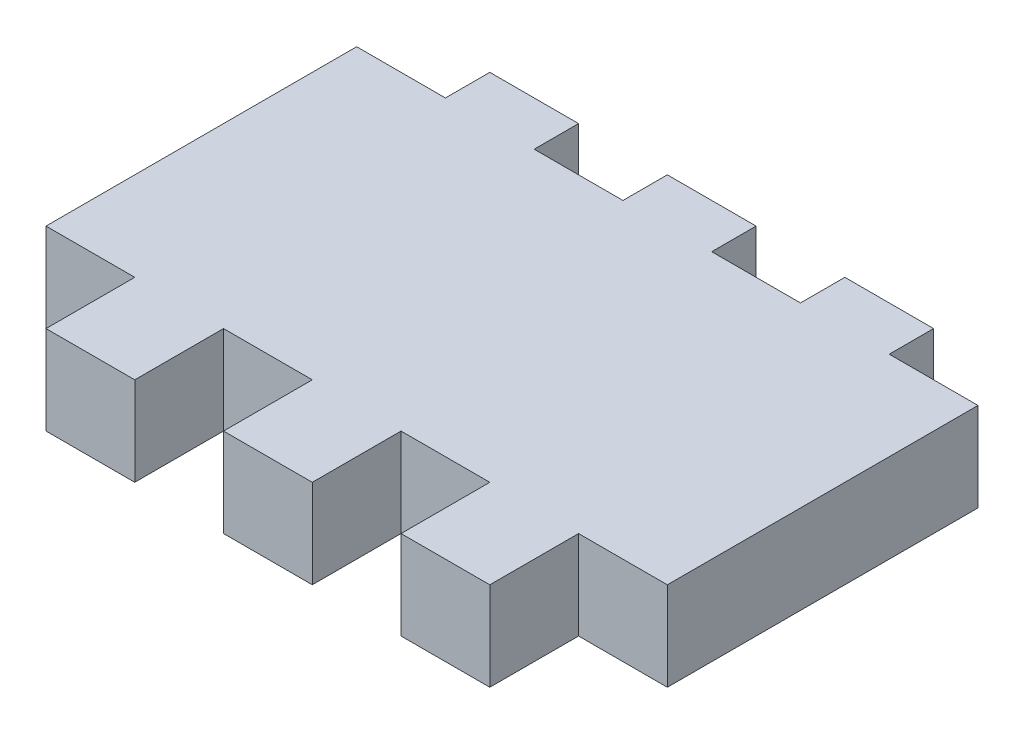
ISO-10303-21;
HEADER;
FILE_DESCRIPTION(('STEP AP214'),'2;1');
FILE_NAME('part.step','',(''),(''),'','','');
FILE_SCHEMA(('AUTOMOTIVE_DESIGN { 1 0 10303 214 1 1 1 1 }'));
ENDSEC;
DATA;
#1=APPLICATION_CONTEXT('core data for automotive mechanical design processes');
#2=APPLICATION_PROTOCOL_DEFINITION('international standard','automotive_design',2000,#1);
#3=PRODUCT_CONTEXT('',#1,'mechanical');
#4=PRODUCT('Part','Part','',(#3));
#5=PRODUCT_RELATED_PRODUCT_CATEGORY('part','',(#4));
#6=PRODUCT_DEFINITION_FORMATION('','',#4);
#7=PRODUCT_DEFINITION_CONTEXT('part definition',#1,'design');
#8=PRODUCT_DEFINITION('design','',#6,#7);
#9=PRODUCT_DEFINITION_SHAPE('','',#8);
#10=(LENGTH_UNIT() NAMED_UNIT(*) SI_UNIT(.MILLI.,.METRE.));
#11=(NAMED_UNIT(*) PLANE_ANGLE_UNIT() SI_UNIT($,.RADIAN.));
#12=(NAMED_UNIT(*) SI_UNIT($,.STERADIAN.) SOLID_ANGLE_UNIT());
#13=UNCERTAINTY_MEASURE_WITH_UNIT(LENGTH_MEASURE(1.E-05),#10,'distance_accuracy_value','');
#14=(GEOMETRIC_REPRESENTATION_CONTEXT(3) GLOBAL_UNCERTAINTY_ASSIGNED_CONTEXT((#13)) GLOBAL_UNIT_ASSIGNED_CONTEXT((#10,
#11,#12)) REPRESENTATION_CONTEXT('',''));
#15=CARTESIAN_POINT('',(0.,0.,0.));
#16=DIRECTION('',(0.,0.,1.));
#17=DIRECTION('',(1.,0.,0.));
#18=AXIS2_PLACEMENT_3D('',#15,#16,#17);
#19=CARTESIAN_POINT('',(-35.,10.,-25.));
#20=DIRECTION('',(0.,0.,1.));
#21=DIRECTION('',(1.,0.,0.));
#22=AXIS2_PLACEMENT_3D('',#19,#20,#21);
#23=PLANE('',#22);
#24=DIRECTION('',(-1.,0.,0.));
#25=VECTOR('',#24,1.);
#26=CARTESIAN_POINT('',(-35.,10.,-25.));
#27=LINE('',#26,#25);
#28=CARTESIAN_POINT('',(4.99999999999999,10.,-25.));
#29=VERTEX_POINT('',#28);
#30=CARTESIAN_POINT('',(-5.00000000000001,10.,-25.));
#31=VERTEX_POINT('',#30);
#32=EDGE_CURVE('E275',#29,#31,#27,.T.);
#33=ORIENTED_EDGE('',*,*,#32,.F.);
#34=DIRECTION('',(0.,1.,0.));
#35=VECTOR('',#34,1.);
#36=CARTESIAN_POINT('',(4.99999999999999,0.,-25.));
#37=LINE('',#36,#35);
#38=CARTESIAN_POINT('',(4.99999999999999,0.,-25.));
#39=VERTEX_POINT('',#38);
#40=EDGE_CURVE('E351',#39,#29,#37,.T.);
#41=ORIENTED_EDGE('',*,*,#40,.F.);
#42=DIRECTION('',(-1.,0.,0.));
#43=VECTOR('',#42,1.);
#44=CARTESIAN_POINT('',(-35.,0.,-25.));
#45=LINE('',#44,#43);
#46=CARTESIAN_POINT('',(-5.00000000000001,0.,-25.));
#47=VERTEX_POINT('',#46);
#48=EDGE_CURVE('E263',#39,#47,#45,.T.);
#49=ORIENTED_EDGE('',*,*,#48,.T.);
#50=DIRECTION('',(0.,1.,0.));
#51=VECTOR('',#50,1.);
#52=CARTESIAN_POINT('',(-5.00000000000001,0.,-25.));
#53=LINE('',#52,#51);
#54=EDGE_CURVE('E321',#47,#31,#53,.T.);
#55=ORIENTED_EDGE('',*,*,#54,.T.);
#56=EDGE_LOOP('',(#33,#41,#49,#55));
#57=FACE_BOUND('',#56,.T.);
#58=ADVANCED_FACE('F35',(#57),#23,.F.);
#59=CARTESIAN_POINT('',(-35.,10.,25.));
#60=DIRECTION('',(0.,0.,-1.));
#61=DIRECTION('',(-1.,0.,0.));
#62=AXIS2_PLACEMENT_3D('',#59,#60,#61);
#63=PLANE('',#62);
#64=DIRECTION('',(1.,0.,0.));
#65=VECTOR('',#64,1.);
#66=CARTESIAN_POINT('',(-35.,0.,25.));
#67=LINE('',#66,#65);
#68=CARTESIAN_POINT('',(-5.00000000000001,0.,25.));
#69=VERTEX_POINT('',#68);
#70=CARTESIAN_POINT('',(4.99999999999999,0.,25.));
#71=VERTEX_POINT('',#70);
#72=EDGE_CURVE('E239',#69,#71,#67,.T.);
#73=ORIENTED_EDGE('',*,*,#72,.T.);
#74=DIRECTION('',(0.,1.,0.));
#75=VECTOR('',#74,1.);
#76=CARTESIAN_POINT('',(4.99999999999999,0.,25.));
#77=LINE('',#76,#75);
#78=CARTESIAN_POINT('',(4.99999999999999,10.,25.));
#79=VERTEX_POINT('',#78);
#80=EDGE_CURVE('E223',#71,#79,#77,.T.);
#81=ORIENTED_EDGE('',*,*,#80,.T.);
#82=DIRECTION('',(1.,0.,0.));
#83=VECTOR('',#82,1.);
#84=CARTESIAN_POINT('',(-35.,10.,25.));
#85=LINE('',#84,#83);
#86=CARTESIAN_POINT('',(-5.00000000000001,10.,25.));
#87=VERTEX_POINT('',#86);
#88=EDGE_CURVE('E44',#87,#79,#85,.T.);
#89=ORIENTED_EDGE('',*,*,#88,.F.);
#90=DIRECTION('',(0.,1.,0.));
#91=VECTOR('',#90,1.);
#92=CARTESIAN_POINT('',(-5.00000000000001,0.,25.));
#93=LINE('',#92,#91);
#94=EDGE_CURVE('E246',#69,#87,#93,.T.);
#95=ORIENTED_EDGE('',*,*,#94,.F.);
#96=EDGE_LOOP('',(#73,#81,#89,#95));
#97=FACE_BOUND('',#96,.T.);
#98=ADVANCED_FACE('F245',(#97),#63,.F.);
#99=CARTESIAN_POINT('',(-25.,0.,25.));
#100=VERTEX_POINT('',#99);
#101=CARTESIAN_POINT('',(-15.,0.,25.));
#102=VERTEX_POINT('',#101);
#103=EDGE_CURVE('E39',#100,#102,#67,.T.);
#104=ORIENTED_EDGE('',*,*,#103,.T.);
#105=DIRECTION('',(0.,1.,0.));
#106=VECTOR('',#105,1.);
#107=CARTESIAN_POINT('',(-15.,0.,25.));
#108=LINE('',#107,#106);
#109=CARTESIAN_POINT('',(-15.,10.,25.));
#110=VERTEX_POINT('',#109);
#111=EDGE_CURVE('E371',#102,#110,#108,.T.);
#112=ORIENTED_EDGE('',*,*,#111,.T.);
#113=CARTESIAN_POINT('',(-25.,10.,25.));
#114=VERTEX_POINT('',#113);
#115=EDGE_CURVE('E11',#114,#110,#85,.T.);
#116=ORIENTED_EDGE('',*,*,#115,.F.);
#117=DIRECTION('',(0.,1.,0.));
#118=VECTOR('',#117,1.);
#119=CARTESIAN_POINT('',(-25.,0.,25.));
#120=LINE('',#119,#118);
#121=EDGE_CURVE('E299',#100,#114,#120,.T.);
#122=ORIENTED_EDGE('',*,*,#121,.F.);
#123=EDGE_LOOP('',(#104,#112,#116,#122));
#124=FACE_BOUND('',#123,.T.);
#125=ADVANCED_FACE('F461',(#124),#63,.F.);
#126=CARTESIAN_POINT('',(-15.,10.,-25.));
#127=VERTEX_POINT('',#126);
#128=CARTESIAN_POINT('',(-25.,10.,-25.));
#129=VERTEX_POINT('',#128);
#130=EDGE_CURVE('E277',#127,#129,#27,.T.);
#131=ORIENTED_EDGE('',*,*,#130,.F.);
#132=DIRECTION('',(0.,1.,0.));
#133=VECTOR('',#132,1.);
#134=CARTESIAN_POINT('',(-15.,0.,-25.));
#135=LINE('',#134,#133);
#136=CARTESIAN_POINT('',(-15.,0.,-25.));
#137=VERTEX_POINT('',#136);
#138=EDGE_CURVE('E311',#137,#127,#135,.T.);
#139=ORIENTED_EDGE('',*,*,#138,.F.);
#140=CARTESIAN_POINT('',(-25.,0.,-25.));
#141=VERTEX_POINT('',#140);
#142=EDGE_CURVE('E265',#137,#141,#45,.T.);
#143=ORIENTED_EDGE('',*,*,#142,.T.);
#144=DIRECTION('',(0.,1.,0.));
#145=VECTOR('',#144,1.);
#146=CARTESIAN_POINT('',(-25.,0.,-25.));
#147=LINE('',#146,#145);
#148=EDGE_CURVE('E269',#141,#129,#147,.T.);
#149=ORIENTED_EDGE('',*,*,#148,.T.);
#150=EDGE_LOOP('',(#131,#139,#143,#149));
#151=FACE_BOUND('',#150,.T.);
#152=ADVANCED_FACE('F483',(#151),#23,.F.);
#153=CARTESIAN_POINT('',(35.,10.,25.));
#154=DIRECTION('',(-1.,0.,0.));
#155=DIRECTION('',(0.,0.,1.));
#156=AXIS2_PLACEMENT_3D('',#153,#154,#155);
#157=PLANE('',#156);
#158=DIRECTION('',(0.,0.,-1.));
#159=VECTOR('',#158,1.);
#160=CARTESIAN_POINT('',(35.,10.,25.));
#161=LINE('',#160,#159);
#162=CARTESIAN_POINT('',(35.,10.,15.));
#163=VERTEX_POINT('',#162);
#164=CARTESIAN_POINT('',(35.,10.,-20.));
#165=VERTEX_POINT('',#164);
#166=EDGE_CURVE('E249',#163,#165,#161,.T.);
#167=ORIENTED_EDGE('',*,*,#166,.F.);
#168=DIRECTION('',(0.,1.,0.));
#169=VECTOR('',#168,1.);
#170=CARTESIAN_POINT('',(35.,0.,15.));
#171=LINE('',#170,#169);
#172=CARTESIAN_POINT('',(35.,0.,15.));
#173=VERTEX_POINT('',#172);
#174=EDGE_CURVE('E395',#173,#163,#171,.T.);
#175=ORIENTED_EDGE('',*,*,#174,.F.);
#176=DIRECTION('',(0.,0.,-1.));
#177=VECTOR('',#176,1.);
#178=CARTESIAN_POINT('',(35.,0.,25.));
#179=LINE('',#178,#177);
#180=CARTESIAN_POINT('',(35.,0.,-20.));
#181=VERTEX_POINT('',#180);
#182=EDGE_CURVE('E267',#173,#181,#179,.T.);
#183=ORIENTED_EDGE('',*,*,#182,.T.);
#184=DIRECTION('',(0.,1.,0.));
#185=VECTOR('',#184,1.);
#186=CARTESIAN_POINT('',(35.,0.,-20.));
#187=LINE('',#186,#185);
#188=EDGE_CURVE('E411',#181,#165,#187,.T.);
#189=ORIENTED_EDGE('',*,*,#188,.T.);
#190=EDGE_LOOP('',(#167,#175,#183,#189));
#191=FACE_BOUND('',#190,.T.);
#192=ADVANCED_FACE('F37',(#191),#157,.F.);
#193=CARTESIAN_POINT('',(25.,10.,-25.));
#194=VERTEX_POINT('',#193);
#195=CARTESIAN_POINT('',(15.,10.,-25.));
#196=VERTEX_POINT('',#195);
#197=EDGE_CURVE('E274',#194,#196,#27,.T.);
#198=ORIENTED_EDGE('',*,*,#197,.F.);
#199=DIRECTION('',(0.,1.,0.));
#200=VECTOR('',#199,1.);
#201=CARTESIAN_POINT('',(25.,0.,-25.));
#202=LINE('',#201,#200);
#203=CARTESIAN_POINT('',(25.,0.,-25.));
#204=VERTEX_POINT('',#203);
#205=EDGE_CURVE('E415',#204,#194,#202,.T.);
#206=ORIENTED_EDGE('',*,*,#205,.F.);
#207=CARTESIAN_POINT('',(15.,0.,-25.));
#208=VERTEX_POINT('',#207);
#209=EDGE_CURVE('E257',#204,#208,#45,.T.);
#210=ORIENTED_EDGE('',*,*,#209,.T.);
#211=DIRECTION('',(0.,1.,0.));
#212=VECTOR('',#211,1.);
#213=CARTESIAN_POINT('',(15.,0.,-25.));
#214=LINE('',#213,#212);
#215=EDGE_CURVE('E348',#208,#196,#214,.T.);
#216=ORIENTED_EDGE('',*,*,#215,.T.);
#217=EDGE_LOOP('',(#198,#206,#210,#216));
#218=FACE_BOUND('',#217,.T.);
#219=ADVANCED_FACE('F516',(#218),#23,.F.);
#220=CARTESIAN_POINT('',(-35.,10.,25.));
#221=DIRECTION('',(1.,0.,0.));
#222=DIRECTION('',(0.,0.,-1.));
#223=AXIS2_PLACEMENT_3D('',#220,#221,#222);
#224=PLANE('',#223);
#225=DIRECTION('',(0.,0.,1.));
#226=VECTOR('',#225,1.);
#227=CARTESIAN_POINT('',(-35.,0.,25.));
#228=LINE('',#227,#226);
#229=CARTESIAN_POINT('',(-35.,0.,-20.));
#230=VERTEX_POINT('',#229);
#231=CARTESIAN_POINT('',(-35.,0.,15.));
#232=VERTEX_POINT('',#231);
#233=EDGE_CURVE('E251',#230,#232,#228,.T.);
#234=ORIENTED_EDGE('',*,*,#233,.T.);
#235=DIRECTION('',(0.,1.,0.));
#236=VECTOR('',#235,1.);
#237=CARTESIAN_POINT('',(-35.,0.,15.));
#238=LINE('',#237,#236);
#239=CARTESIAN_POINT('',(-35.,10.,15.));
#240=VERTEX_POINT('',#239);
#241=EDGE_CURVE('E294',#232,#240,#238,.T.);
#242=ORIENTED_EDGE('',*,*,#241,.T.);
#243=DIRECTION('',(0.,0.,1.));
#244=VECTOR('',#243,1.);
#245=CARTESIAN_POINT('',(-35.,10.,25.));
#246=LINE('',#245,#244);
#247=CARTESIAN_POINT('',(-35.,10.,-20.));
#248=VERTEX_POINT('',#247);
#249=EDGE_CURVE('E271',#248,#240,#246,.T.);
#250=ORIENTED_EDGE('',*,*,#249,.F.);
#251=DIRECTION('',(0.,1.,0.));
#252=VECTOR('',#251,1.);
#253=CARTESIAN_POINT('',(-35.,0.,-20.));
#254=LINE('',#253,#252);
#255=EDGE_CURVE('E280',#230,#248,#254,.T.);
#256=ORIENTED_EDGE('',*,*,#255,.F.);
#257=EDGE_LOOP('',(#234,#242,#250,#256));
#258=FACE_BOUND('',#257,.T.);
#259=ADVANCED_FACE('F471',(#258),#224,.F.);
#260=CARTESIAN_POINT('',(15.,0.,25.));
#261=VERTEX_POINT('',#260);
#262=CARTESIAN_POINT('',(25.,0.,25.));
#263=VERTEX_POINT('',#262);
#264=EDGE_CURVE('E247',#261,#263,#67,.T.);
#265=ORIENTED_EDGE('',*,*,#264,.T.);
#266=DIRECTION('',(0.,1.,0.));
#267=VECTOR('',#266,1.);
#268=CARTESIAN_POINT('',(25.,0.,25.));
#269=LINE('',#268,#267);
#270=CARTESIAN_POINT('',(25.,10.,25.));
#271=VERTEX_POINT('',#270);
#272=EDGE_CURVE('E393',#263,#271,#269,.T.);
#273=ORIENTED_EDGE('',*,*,#272,.T.);
#274=CARTESIAN_POINT('',(15.,10.,25.));
#275=VERTEX_POINT('',#274);
#276=EDGE_CURVE('E46',#275,#271,#85,.T.);
#277=ORIENTED_EDGE('',*,*,#276,.F.);
#278=DIRECTION('',(0.,1.,0.));
#279=VECTOR('',#278,1.);
#280=CARTESIAN_POINT('',(15.,0.,25.));
#281=LINE('',#280,#279);
#282=EDGE_CURVE('E233',#261,#275,#281,.T.);
#283=ORIENTED_EDGE('',*,*,#282,.F.);
#284=EDGE_LOOP('',(#265,#273,#277,#283));
#285=FACE_BOUND('',#284,.T.);
#286=ADVANCED_FACE('F441',(#285),#63,.F.);
#287=CARTESIAN_POINT('',(0.,10.,0.));
#288=DIRECTION('',(0.,-1.,0.));
#289=DIRECTION('',(0.,0.,-1.));
#290=AXIS2_PLACEMENT_3D('',#287,#288,#289);
#291=PLANE('',#290);
#292=ORIENTED_EDGE('',*,*,#276,.T.);
#293=DIRECTION('',(0.,0.,1.));
#294=VECTOR('',#293,1.);
#295=CARTESIAN_POINT('',(25.,10.,25.));
#296=LINE('',#295,#294);
#297=CARTESIAN_POINT('',(25.,10.,15.));
#298=VERTEX_POINT('',#297);
#299=EDGE_CURVE('E404',#298,#271,#296,.T.);
#300=ORIENTED_EDGE('',*,*,#299,.F.);
#301=DIRECTION('',(-1.,0.,0.));
#302=VECTOR('',#301,1.);
#303=CARTESIAN_POINT('',(25.,10.,15.));
#304=LINE('',#303,#302);
#305=EDGE_CURVE('E401',#163,#298,#304,.T.);
#306=ORIENTED_EDGE('',*,*,#305,.F.);
#307=ORIENTED_EDGE('',*,*,#166,.T.);
#308=DIRECTION('',(1.,0.,0.));
#309=VECTOR('',#308,1.);
#310=CARTESIAN_POINT('',(25.,10.,-20.));
#311=LINE('',#310,#309);
#312=CARTESIAN_POINT('',(25.,10.,-20.));
#313=VERTEX_POINT('',#312);
#314=EDGE_CURVE('E417',#313,#165,#311,.T.);
#315=ORIENTED_EDGE('',*,*,#314,.F.);
#316=DIRECTION('',(0.,0.,1.));
#317=VECTOR('',#316,1.);
#318=CARTESIAN_POINT('',(25.,10.,-25.));
#319=LINE('',#318,#317);
#320=EDGE_CURVE('E400',#194,#313,#319,.T.);
#321=ORIENTED_EDGE('',*,*,#320,.F.);
#322=ORIENTED_EDGE('',*,*,#197,.T.);
#323=DIRECTION('',(0.,0.,-1.));
#324=VECTOR('',#323,1.);
#325=CARTESIAN_POINT('',(15.,10.,-25.));
#326=LINE('',#325,#324);
#327=CARTESIAN_POINT('',(15.,10.,-20.));
#328=VERTEX_POINT('',#327);
#329=EDGE_CURVE('E354',#328,#196,#326,.T.);
#330=ORIENTED_EDGE('',*,*,#329,.F.);
#331=DIRECTION('',(1.,0.,0.));
#332=VECTOR('',#331,1.);
#333=CARTESIAN_POINT('',(4.99999999999999,10.,-20.));
#334=LINE('',#333,#332);
#335=CARTESIAN_POINT('',(4.99999999999999,10.,-20.));
#336=VERTEX_POINT('',#335);
#337=EDGE_CURVE('E357',#336,#328,#334,.T.);
#338=ORIENTED_EDGE('',*,*,#337,.F.);
#339=DIRECTION('',(0.,0.,1.));
#340=VECTOR('',#339,1.);
#341=CARTESIAN_POINT('',(4.99999999999999,10.,-25.));
#342=LINE('',#341,#340);
#343=EDGE_CURVE('E360',#29,#336,#342,.T.);
#344=ORIENTED_EDGE('',*,*,#343,.F.);
#345=ORIENTED_EDGE('',*,*,#32,.T.);
#346=DIRECTION('',(0.,0.,-1.));
#347=VECTOR('',#346,1.);
#348=CARTESIAN_POINT('',(-5.00000000000001,10.,-25.));
#349=LINE('',#348,#347);
#350=CARTESIAN_POINT('',(-5.00000000000001,10.,-20.));
#351=VERTEX_POINT('',#350);
#352=EDGE_CURVE('E325',#351,#31,#349,.T.);
#353=ORIENTED_EDGE('',*,*,#352,.F.);
#354=DIRECTION('',(1.,0.,0.));
#355=VECTOR('',#354,1.);
#356=CARTESIAN_POINT('',(-15.,10.,-20.));
#357=LINE('',#356,#355);
#358=CARTESIAN_POINT('',(-15.,10.,-20.));
#359=VERTEX_POINT('',#358);
#360=EDGE_CURVE('E329',#359,#351,#357,.T.);
#361=ORIENTED_EDGE('',*,*,#360,.F.);
#362=DIRECTION('',(0.,0.,1.));
#363=VECTOR('',#362,1.);
#364=CARTESIAN_POINT('',(-15.,10.,-25.));
#365=LINE('',#364,#363);
#366=EDGE_CURVE('E332',#127,#359,#365,.T.);
#367=ORIENTED_EDGE('',*,*,#366,.F.);
#368=ORIENTED_EDGE('',*,*,#130,.T.);
#369=DIRECTION('',(0.,0.,-1.));
#370=VECTOR('',#369,1.);
#371=CARTESIAN_POINT('',(-25.,10.,-25.));
#372=LINE('',#371,#370);
#373=CARTESIAN_POINT('',(-25.,10.,-20.));
#374=VERTEX_POINT('',#373);
#375=EDGE_CURVE('E287',#374,#129,#372,.T.);
#376=ORIENTED_EDGE('',*,*,#375,.F.);
#377=DIRECTION('',(1.,0.,0.));
#378=VECTOR('',#377,1.);
#379=CARTESIAN_POINT('',(-35.,10.,-20.));
#380=LINE('',#379,#378);
#381=EDGE_CURVE('E291',#248,#374,#380,.T.);
#382=ORIENTED_EDGE('',*,*,#381,.F.);
#383=ORIENTED_EDGE('',*,*,#249,.T.);
#384=DIRECTION('',(-1.,0.,0.));
#385=VECTOR('',#384,1.);
#386=CARTESIAN_POINT('',(-35.,10.,15.));
#387=LINE('',#386,#385);
#388=CARTESIAN_POINT('',(-25.,10.,15.));
#389=VERTEX_POINT('',#388);
#390=EDGE_CURVE('E305',#389,#240,#387,.T.);
#391=ORIENTED_EDGE('',*,*,#390,.F.);
#392=DIRECTION('',(0.,0.,-1.));
#393=VECTOR('',#392,1.);
#394=CARTESIAN_POINT('',(-25.,10.,25.));
#395=LINE('',#394,#393);
#396=EDGE_CURVE('E308',#114,#389,#395,.T.);
#397=ORIENTED_EDGE('',*,*,#396,.F.);
#398=ORIENTED_EDGE('',*,*,#115,.T.);
#399=DIRECTION('',(0.,0.,1.));
#400=VECTOR('',#399,1.);
#401=CARTESIAN_POINT('',(-15.,10.,25.));
#402=LINE('',#401,#400);
#403=CARTESIAN_POINT('',(-15.,10.,15.));
#404=VERTEX_POINT('',#403);
#405=EDGE_CURVE('E353',#404,#110,#402,.T.);
#406=ORIENTED_EDGE('',*,*,#405,.F.);
#407=DIRECTION('',(-1.,0.,0.));
#408=VECTOR('',#407,1.);
#409=CARTESIAN_POINT('',(-15.,10.,15.));
#410=LINE('',#409,#408);
#411=CARTESIAN_POINT('',(-5.00000000000001,10.,15.));
#412=VERTEX_POINT('',#411);
#413=EDGE_CURVE('E379',#412,#404,#410,.T.);
#414=ORIENTED_EDGE('',*,*,#413,.F.);
#415=DIRECTION('',(0.,0.,-1.));
#416=VECTOR('',#415,1.);
#417=CARTESIAN_POINT('',(-5.00000000000001,10.,25.));
#418=LINE('',#417,#416);
#419=EDGE_CURVE('E383',#87,#412,#418,.T.);
#420=ORIENTED_EDGE('',*,*,#419,.F.);
#421=ORIENTED_EDGE('',*,*,#88,.T.);
#422=DIRECTION('',(0.,0.,1.));
#423=VECTOR('',#422,1.);
#424=CARTESIAN_POINT('',(4.99999999999999,10.,25.));
#425=LINE('',#424,#423);
#426=CARTESIAN_POINT('',(4.99999999999999,10.,15.));
#427=VERTEX_POINT('',#426);
#428=EDGE_CURVE('E228',#427,#79,#425,.T.);
#429=ORIENTED_EDGE('',*,*,#428,.F.);
#430=DIRECTION('',(-1.,0.,0.));
#431=VECTOR('',#430,1.);
#432=CARTESIAN_POINT('',(4.99999999999999,10.,15.));
#433=LINE('',#432,#431);
#434=CARTESIAN_POINT('',(15.,10.,15.));
#435=VERTEX_POINT('',#434);
#436=EDGE_CURVE('E242',#435,#427,#433,.T.);
#437=ORIENTED_EDGE('',*,*,#436,.F.);
#438=DIRECTION('',(0.,0.,-1.));
#439=VECTOR('',#438,1.);
#440=CARTESIAN_POINT('',(15.,10.,25.));
#441=LINE('',#440,#439);
#442=EDGE_CURVE('E432',#275,#435,#441,.T.);
#443=ORIENTED_EDGE('',*,*,#442,.F.);
#444=EDGE_LOOP('',(#292,#300,#306,#307,#315,#321,#322,#330,#338,#344,#345,#353,#361,#367,#368,
#376,#382,#383,#391,#397,#398,#406,#414,#420,#421,#429,#437,#443));
#445=FACE_BOUND('',#444,.T.);
#446=ADVANCED_FACE('F446',(#445),#291,.F.);
#447=CARTESIAN_POINT('',(0.,0.,0.));
#448=DIRECTION('',(0.,-1.,0.));
#449=DIRECTION('',(0.,0.,-1.));
#450=AXIS2_PLACEMENT_3D('',#447,#448,#449);
#451=PLANE('',#450);
#452=DIRECTION('',(0.,0.,1.));
#453=VECTOR('',#452,1.);
#454=CARTESIAN_POINT('',(25.,0.,25.));
#455=LINE('',#454,#453);
#456=CARTESIAN_POINT('',(25.,0.,15.));
#457=VERTEX_POINT('',#456);
#458=EDGE_CURVE('E53',#457,#263,#455,.T.);
#459=ORIENTED_EDGE('',*,*,#458,.T.);
#460=ORIENTED_EDGE('',*,*,#264,.F.);
#461=DIRECTION('',(0.,0.,-1.));
#462=VECTOR('',#461,1.);
#463=CARTESIAN_POINT('',(15.,0.,25.));
#464=LINE('',#463,#462);
#465=CARTESIAN_POINT('',(15.,0.,15.));
#466=VERTEX_POINT('',#465);
#467=EDGE_CURVE('E241',#261,#466,#464,.T.);
#468=ORIENTED_EDGE('',*,*,#467,.T.);
#469=DIRECTION('',(-1.,0.,0.));
#470=VECTOR('',#469,1.);
#471=CARTESIAN_POINT('',(4.99999999999999,0.,15.));
#472=LINE('',#471,#470);
#473=CARTESIAN_POINT('',(4.99999999999999,0.,15.));
#474=VERTEX_POINT('',#473);
#475=EDGE_CURVE('E61',#466,#474,#472,.T.);
#476=ORIENTED_EDGE('',*,*,#475,.T.);
#477=DIRECTION('',(0.,0.,1.));
#478=VECTOR('',#477,1.);
#479=CARTESIAN_POINT('',(4.99999999999999,0.,25.));
#480=LINE('',#479,#478);
#481=EDGE_CURVE('E226',#474,#71,#480,.T.);
#482=ORIENTED_EDGE('',*,*,#481,.T.);
#483=ORIENTED_EDGE('',*,*,#72,.F.);
#484=DIRECTION('',(0.,0.,-1.));
#485=VECTOR('',#484,1.);
#486=CARTESIAN_POINT('',(-5.00000000000001,0.,25.));
#487=LINE('',#486,#485);
#488=CARTESIAN_POINT('',(-5.00000000000001,0.,15.));
#489=VERTEX_POINT('',#488);
#490=EDGE_CURVE('E389',#69,#489,#487,.T.);
#491=ORIENTED_EDGE('',*,*,#490,.T.);
#492=DIRECTION('',(-1.,0.,0.));
#493=VECTOR('',#492,1.);
#494=CARTESIAN_POINT('',(-15.,0.,15.));
#495=LINE('',#494,#493);
#496=CARTESIAN_POINT('',(-15.,0.,15.));
#497=VERTEX_POINT('',#496);
#498=EDGE_CURVE('E374',#489,#497,#495,.T.);
#499=ORIENTED_EDGE('',*,*,#498,.T.);
#500=DIRECTION('',(0.,0.,1.));
#501=VECTOR('',#500,1.);
#502=CARTESIAN_POINT('',(-15.,0.,25.));
#503=LINE('',#502,#501);
#504=EDGE_CURVE('E382',#497,#102,#503,.T.);
#505=ORIENTED_EDGE('',*,*,#504,.T.);
#506=ORIENTED_EDGE('',*,*,#103,.F.);
#507=DIRECTION('',(0.,0.,-1.));
#508=VECTOR('',#507,1.);
#509=CARTESIAN_POINT('',(-25.,0.,25.));
#510=LINE('',#509,#508);
#511=CARTESIAN_POINT('',(-25.,0.,15.));
#512=VERTEX_POINT('',#511);
#513=EDGE_CURVE('E307',#100,#512,#510,.T.);
#514=ORIENTED_EDGE('',*,*,#513,.T.);
#515=DIRECTION('',(-1.,0.,0.));
#516=VECTOR('',#515,1.);
#517=CARTESIAN_POINT('',(-35.,0.,15.));
#518=LINE('',#517,#516);
#519=EDGE_CURVE('E302',#512,#232,#518,.T.);
#520=ORIENTED_EDGE('',*,*,#519,.T.);
#521=ORIENTED_EDGE('',*,*,#233,.F.);
#522=DIRECTION('',(1.,0.,0.));
#523=VECTOR('',#522,1.);
#524=CARTESIAN_POINT('',(-35.,0.,-20.));
#525=LINE('',#524,#523);
#526=CARTESIAN_POINT('',(-25.,0.,-20.));
#527=VERTEX_POINT('',#526);
#528=EDGE_CURVE('E290',#230,#527,#525,.T.);
#529=ORIENTED_EDGE('',*,*,#528,.T.);
#530=DIRECTION('',(0.,0.,-1.));
#531=VECTOR('',#530,1.);
#532=CARTESIAN_POINT('',(-25.,0.,-25.));
#533=LINE('',#532,#531);
#534=EDGE_CURVE('E283',#527,#141,#533,.T.);
#535=ORIENTED_EDGE('',*,*,#534,.T.);
#536=ORIENTED_EDGE('',*,*,#142,.F.);
#537=DIRECTION('',(0.,0.,1.));
#538=VECTOR('',#537,1.);
#539=CARTESIAN_POINT('',(-15.,0.,-25.));
#540=LINE('',#539,#538);
#541=CARTESIAN_POINT('',(-15.,0.,-20.));
#542=VERTEX_POINT('',#541);
#543=EDGE_CURVE('E328',#137,#542,#540,.T.);
#544=ORIENTED_EDGE('',*,*,#543,.T.);
#545=DIRECTION('',(1.,0.,0.));
#546=VECTOR('',#545,1.);
#547=CARTESIAN_POINT('',(-15.,0.,-20.));
#548=LINE('',#547,#546);
#549=CARTESIAN_POINT('',(-5.00000000000001,0.,-20.));
#550=VERTEX_POINT('',#549);
#551=EDGE_CURVE('E338',#542,#550,#548,.T.);
#552=ORIENTED_EDGE('',*,*,#551,.T.);
#553=DIRECTION('',(0.,0.,-1.));
#554=VECTOR('',#553,1.);
#555=CARTESIAN_POINT('',(-5.00000000000001,0.,-25.));
#556=LINE('',#555,#554);
#557=EDGE_CURVE('E319',#550,#47,#556,.T.);
#558=ORIENTED_EDGE('',*,*,#557,.T.);
#559=ORIENTED_EDGE('',*,*,#48,.F.);
#560=DIRECTION('',(0.,0.,1.));
#561=VECTOR('',#560,1.);
#562=CARTESIAN_POINT('',(4.99999999999999,0.,-25.));
#563=LINE('',#562,#561);
#564=CARTESIAN_POINT('',(4.99999999999999,0.,-20.));
#565=VERTEX_POINT('',#564);
#566=EDGE_CURVE('E356',#39,#565,#563,.T.);
#567=ORIENTED_EDGE('',*,*,#566,.T.);
#568=DIRECTION('',(1.,0.,0.));
#569=VECTOR('',#568,1.);
#570=CARTESIAN_POINT('',(4.99999999999999,0.,-20.));
#571=LINE('',#570,#569);
#572=CARTESIAN_POINT('',(15.,0.,-20.));
#573=VERTEX_POINT('',#572);
#574=EDGE_CURVE('E366',#565,#573,#571,.T.);
#575=ORIENTED_EDGE('',*,*,#574,.T.);
#576=DIRECTION('',(0.,0.,-1.));
#577=VECTOR('',#576,1.);
#578=CARTESIAN_POINT('',(15.,0.,-25.));
#579=LINE('',#578,#577);
#580=EDGE_CURVE('E346',#573,#208,#579,.T.);
#581=ORIENTED_EDGE('',*,*,#580,.T.);
#582=ORIENTED_EDGE('',*,*,#209,.F.);
#583=DIRECTION('',(0.,0.,1.));
#584=VECTOR('',#583,1.);
#585=CARTESIAN_POINT('',(25.,0.,-25.));
#586=LINE('',#585,#584);
#587=CARTESIAN_POINT('',(25.,0.,-20.));
#588=VERTEX_POINT('',#587);
#589=EDGE_CURVE('E419',#204,#588,#586,.T.);
#590=ORIENTED_EDGE('',*,*,#589,.T.);
#591=DIRECTION('',(1.,0.,0.));
#592=VECTOR('',#591,1.);
#593=CARTESIAN_POINT('',(25.,0.,-20.));
#594=LINE('',#593,#592);
#595=EDGE_CURVE('E412',#588,#181,#594,.T.);
#596=ORIENTED_EDGE('',*,*,#595,.T.);
#597=ORIENTED_EDGE('',*,*,#182,.F.);
#598=DIRECTION('',(-1.,0.,0.));
#599=VECTOR('',#598,1.);
#600=CARTESIAN_POINT('',(25.,0.,15.));
#601=LINE('',#600,#599);
#602=EDGE_CURVE('E396',#173,#457,#601,.T.);
#603=ORIENTED_EDGE('',*,*,#602,.T.);
#604=EDGE_LOOP('',(#459,#460,#468,#476,#482,#483,#491,#499,#505,#506,#514,#520,#521,#529,#535,
#536,#544,#552,#558,#559,#567,#575,#581,#582,#590,#596,#597,#603));
#605=FACE_BOUND('',#604,.T.);
#606=ADVANCED_FACE('F237',(#605),#451,.T.);
#607=CARTESIAN_POINT('',(-25.,0.,-25.));
#608=DIRECTION('',(1.,0.,0.));
#609=DIRECTION('',(0.,0.,-1.));
#610=AXIS2_PLACEMENT_3D('',#607,#608,#609);
#611=PLANE('',#610);
#612=ORIENTED_EDGE('',*,*,#375,.T.);
#613=ORIENTED_EDGE('',*,*,#148,.F.);
#614=ORIENTED_EDGE('',*,*,#534,.F.);
#615=DIRECTION('',(0.,1.,0.));
#616=VECTOR('',#615,1.);
#617=CARTESIAN_POINT('',(-25.,0.,-20.));
#618=LINE('',#617,#616);
#619=EDGE_CURVE('E282',#527,#374,#618,.T.);
#620=ORIENTED_EDGE('',*,*,#619,.T.);
#621=EDGE_LOOP('',(#612,#613,#614,#620));
#622=FACE_BOUND('',#621,.T.);
#623=ADVANCED_FACE('F480',(#622),#611,.F.);
#624=CARTESIAN_POINT('',(-35.,0.,-20.));
#625=DIRECTION('',(0.,0.,1.));
#626=DIRECTION('',(1.,0.,0.));
#627=AXIS2_PLACEMENT_3D('',#624,#625,#626);
#628=PLANE('',#627);
#629=ORIENTED_EDGE('',*,*,#381,.T.);
#630=ORIENTED_EDGE('',*,*,#619,.F.);
#631=ORIENTED_EDGE('',*,*,#528,.F.);
#632=ORIENTED_EDGE('',*,*,#255,.T.);
#633=EDGE_LOOP('',(#629,#630,#631,#632));
#634=FACE_BOUND('',#633,.T.);
#635=ADVANCED_FACE('F476',(#634),#628,.F.);
#636=CARTESIAN_POINT('',(-35.,0.,15.));
#637=DIRECTION('',(0.,0.,-1.));
#638=DIRECTION('',(-1.,0.,0.));
#639=AXIS2_PLACEMENT_3D('',#636,#637,#638);
#640=PLANE('',#639);
#641=ORIENTED_EDGE('',*,*,#390,.T.);
#642=ORIENTED_EDGE('',*,*,#241,.F.);
#643=ORIENTED_EDGE('',*,*,#519,.F.);
#644=DIRECTION('',(0.,1.,0.));
#645=VECTOR('',#644,1.);
#646=CARTESIAN_POINT('',(-25.,0.,15.));
#647=LINE('',#646,#645);
#648=EDGE_CURVE('E301',#512,#389,#647,.T.);
#649=ORIENTED_EDGE('',*,*,#648,.T.);
#650=EDGE_LOOP('',(#641,#642,#643,#649));
#651=FACE_BOUND('',#650,.T.);
#652=ADVANCED_FACE('F469',(#651),#640,.F.);
#653=CARTESIAN_POINT('',(-25.,0.,25.));
#654=DIRECTION('',(1.,0.,0.));
#655=DIRECTION('',(0.,0.,-1.));
#656=AXIS2_PLACEMENT_3D('',#653,#654,#655);
#657=PLANE('',#656);
#658=ORIENTED_EDGE('',*,*,#396,.T.);
#659=ORIENTED_EDGE('',*,*,#648,.F.);
#660=ORIENTED_EDGE('',*,*,#513,.F.);
#661=ORIENTED_EDGE('',*,*,#121,.T.);
#662=EDGE_LOOP('',(#658,#659,#660,#661));
#663=FACE_BOUND('',#662,.T.);
#664=ADVANCED_FACE('F467',(#663),#657,.F.);
#665=CARTESIAN_POINT('',(-15.,0.,-25.));
#666=DIRECTION('',(-1.,0.,0.));
#667=DIRECTION('',(0.,0.,1.));
#668=AXIS2_PLACEMENT_3D('',#665,#666,#667);
#669=PLANE('',#668);
#670=ORIENTED_EDGE('',*,*,#366,.T.);
#671=DIRECTION('',(0.,1.,0.));
#672=VECTOR('',#671,1.);
#673=CARTESIAN_POINT('',(-15.,0.,-20.));
#674=LINE('',#673,#672);
#675=EDGE_CURVE('E316',#542,#359,#674,.T.);
#676=ORIENTED_EDGE('',*,*,#675,.F.);
#677=ORIENTED_EDGE('',*,*,#543,.F.);
#678=ORIENTED_EDGE('',*,*,#138,.T.);
#679=EDGE_LOOP('',(#670,#676,#677,#678));
#680=FACE_BOUND('',#679,.T.);
#681=ADVANCED_FACE('F487',(#680),#669,.F.);
#682=CARTESIAN_POINT('',(-5.00000000000001,0.,-25.));
#683=DIRECTION('',(1.,0.,0.));
#684=DIRECTION('',(0.,0.,-1.));
#685=AXIS2_PLACEMENT_3D('',#682,#683,#684);
#686=PLANE('',#685);
#687=ORIENTED_EDGE('',*,*,#352,.T.);
#688=ORIENTED_EDGE('',*,*,#54,.F.);
#689=ORIENTED_EDGE('',*,*,#557,.F.);
#690=DIRECTION('',(0.,1.,0.));
#691=VECTOR('',#690,1.);
#692=CARTESIAN_POINT('',(-5.00000000000001,0.,-20.));
#693=LINE('',#692,#691);
#694=EDGE_CURVE('E318',#550,#351,#693,.T.);
#695=ORIENTED_EDGE('',*,*,#694,.T.);
#696=EDGE_LOOP('',(#687,#688,#689,#695));
#697=FACE_BOUND('',#696,.T.);
#698=ADVANCED_FACE('F497',(#697),#686,.F.);
#699=CARTESIAN_POINT('',(-15.,0.,-20.));
#700=DIRECTION('',(0.,0.,1.));
#701=DIRECTION('',(1.,0.,0.));
#702=AXIS2_PLACEMENT_3D('',#699,#700,#701);
#703=PLANE('',#702);
#704=ORIENTED_EDGE('',*,*,#360,.T.);
#705=ORIENTED_EDGE('',*,*,#694,.F.);
#706=ORIENTED_EDGE('',*,*,#551,.F.);
#707=ORIENTED_EDGE('',*,*,#675,.T.);
#708=EDGE_LOOP('',(#704,#705,#706,#707));
#709=FACE_BOUND('',#708,.T.);
#710=ADVANCED_FACE('F492',(#709),#703,.F.);
#711=CARTESIAN_POINT('',(-15.,0.,25.));
#712=DIRECTION('',(-1.,0.,0.));
#713=DIRECTION('',(0.,0.,1.));
#714=AXIS2_PLACEMENT_3D('',#711,#712,#713);
#715=PLANE('',#714);
#716=ORIENTED_EDGE('',*,*,#405,.T.);
#717=ORIENTED_EDGE('',*,*,#111,.F.);
#718=ORIENTED_EDGE('',*,*,#504,.F.);
#719=DIRECTION('',(0.,1.,0.));
#720=VECTOR('',#719,1.);
#721=CARTESIAN_POINT('',(-15.,0.,15.));
#722=LINE('',#721,#720);
#723=EDGE_CURVE('E335',#497,#404,#722,.T.);
#724=ORIENTED_EDGE('',*,*,#723,.T.);
#725=EDGE_LOOP('',(#716,#717,#718,#724));
#726=FACE_BOUND('',#725,.T.);
#727=ADVANCED_FACE('F458',(#726),#715,.F.);
#728=CARTESIAN_POINT('',(-15.,0.,15.));
#729=DIRECTION('',(0.,0.,-1.));
#730=DIRECTION('',(-1.,0.,0.));
#731=AXIS2_PLACEMENT_3D('',#728,#729,#730);
#732=PLANE('',#731);
#733=ORIENTED_EDGE('',*,*,#413,.T.);
#734=ORIENTED_EDGE('',*,*,#723,.F.);
#735=ORIENTED_EDGE('',*,*,#498,.F.);
#736=DIRECTION('',(0.,1.,0.));
#737=VECTOR('',#736,1.);
#738=CARTESIAN_POINT('',(-5.00000000000001,0.,15.));
#739=LINE('',#738,#737);
#740=EDGE_CURVE('E376',#489,#412,#739,.T.);
#741=ORIENTED_EDGE('',*,*,#740,.T.);
#742=EDGE_LOOP('',(#733,#734,#735,#741));
#743=FACE_BOUND('',#742,.T.);
#744=ADVANCED_FACE('F456',(#743),#732,.F.);
#745=CARTESIAN_POINT('',(-5.00000000000001,0.,25.));
#746=DIRECTION('',(1.,0.,0.));
#747=DIRECTION('',(0.,0.,-1.));
#748=AXIS2_PLACEMENT_3D('',#745,#746,#747);
#749=PLANE('',#748);
#750=ORIENTED_EDGE('',*,*,#419,.T.);
#751=ORIENTED_EDGE('',*,*,#740,.F.);
#752=ORIENTED_EDGE('',*,*,#490,.F.);
#753=ORIENTED_EDGE('',*,*,#94,.T.);
#754=EDGE_LOOP('',(#750,#751,#752,#753));
#755=FACE_BOUND('',#754,.T.);
#756=ADVANCED_FACE('F452',(#755),#749,.F.);
#757=CARTESIAN_POINT('',(4.99999999999999,0.,-25.));
#758=DIRECTION('',(-1.,0.,0.));
#759=DIRECTION('',(0.,0.,1.));
#760=AXIS2_PLACEMENT_3D('',#757,#758,#759);
#761=PLANE('',#760);
#762=ORIENTED_EDGE('',*,*,#343,.T.);
#763=DIRECTION('',(0.,1.,0.));
#764=VECTOR('',#763,1.);
#765=CARTESIAN_POINT('',(4.99999999999999,0.,-20.));
#766=LINE('',#765,#764);
#767=EDGE_CURVE('E343',#565,#336,#766,.T.);
#768=ORIENTED_EDGE('',*,*,#767,.F.);
#769=ORIENTED_EDGE('',*,*,#566,.F.);
#770=ORIENTED_EDGE('',*,*,#40,.T.);
#771=EDGE_LOOP('',(#762,#768,#769,#770));
#772=FACE_BOUND('',#771,.T.);
#773=ADVANCED_FACE('F503',(#772),#761,.F.);
#774=CARTESIAN_POINT('',(15.,0.,-25.));
#775=DIRECTION('',(1.,0.,0.));
#776=DIRECTION('',(0.,0.,-1.));
#777=AXIS2_PLACEMENT_3D('',#774,#775,#776);
#778=PLANE('',#777);
#779=ORIENTED_EDGE('',*,*,#329,.T.);
#780=ORIENTED_EDGE('',*,*,#215,.F.);
#781=ORIENTED_EDGE('',*,*,#580,.F.);
#782=DIRECTION('',(0.,1.,0.));
#783=VECTOR('',#782,1.);
#784=CARTESIAN_POINT('',(15.,0.,-20.));
#785=LINE('',#784,#783);
#786=EDGE_CURVE('E345',#573,#328,#785,.T.);
#787=ORIENTED_EDGE('',*,*,#786,.T.);
#788=EDGE_LOOP('',(#779,#780,#781,#787));
#789=FACE_BOUND('',#788,.T.);
#790=ADVANCED_FACE('F686',(#789),#778,.F.);
#791=CARTESIAN_POINT('',(4.99999999999999,0.,-20.));
#792=DIRECTION('',(0.,0.,1.));
#793=DIRECTION('',(1.,0.,0.));
#794=AXIS2_PLACEMENT_3D('',#791,#792,#793);
#795=PLANE('',#794);
#796=ORIENTED_EDGE('',*,*,#337,.T.);
#797=ORIENTED_EDGE('',*,*,#786,.F.);
#798=ORIENTED_EDGE('',*,*,#574,.F.);
#799=ORIENTED_EDGE('',*,*,#767,.T.);
#800=EDGE_LOOP('',(#796,#797,#798,#799));
#801=FACE_BOUND('',#800,.T.);
#802=ADVANCED_FACE('F509',(#801),#795,.F.);
#803=CARTESIAN_POINT('',(4.99999999999999,0.,25.));
#804=DIRECTION('',(-1.,0.,0.));
#805=DIRECTION('',(0.,0.,1.));
#806=AXIS2_PLACEMENT_3D('',#803,#804,#805);
#807=PLANE('',#806);
#808=ORIENTED_EDGE('',*,*,#428,.T.);
#809=ORIENTED_EDGE('',*,*,#80,.F.);
#810=ORIENTED_EDGE('',*,*,#481,.F.);
#811=DIRECTION('',(0.,1.,0.));
#812=VECTOR('',#811,1.);
#813=CARTESIAN_POINT('',(4.99999999999999,0.,15.));
#814=LINE('',#813,#812);
#815=EDGE_CURVE('E363',#474,#427,#814,.T.);
#816=ORIENTED_EDGE('',*,*,#815,.T.);
#817=EDGE_LOOP('',(#808,#809,#810,#816));
#818=FACE_BOUND('',#817,.T.);
#819=ADVANCED_FACE('F225',(#818),#807,.F.);
#820=CARTESIAN_POINT('',(4.99999999999999,0.,15.));
#821=DIRECTION('',(0.,0.,-1.));
#822=DIRECTION('',(-1.,0.,0.));
#823=AXIS2_PLACEMENT_3D('',#820,#821,#822);
#824=PLANE('',#823);
#825=ORIENTED_EDGE('',*,*,#436,.T.);
#826=ORIENTED_EDGE('',*,*,#815,.F.);
#827=ORIENTED_EDGE('',*,*,#475,.F.);
#828=DIRECTION('',(0.,1.,0.));
#829=VECTOR('',#828,1.);
#830=CARTESIAN_POINT('',(15.,0.,15.));
#831=LINE('',#830,#829);
#832=EDGE_CURVE('E427',#466,#435,#831,.T.);
#833=ORIENTED_EDGE('',*,*,#832,.T.);
#834=EDGE_LOOP('',(#825,#826,#827,#833));
#835=FACE_BOUND('',#834,.T.);
#836=ADVANCED_FACE('F711',(#835),#824,.F.);
#837=CARTESIAN_POINT('',(15.,0.,25.));
#838=DIRECTION('',(1.,0.,0.));
#839=DIRECTION('',(0.,0.,-1.));
#840=AXIS2_PLACEMENT_3D('',#837,#838,#839);
#841=PLANE('',#840);
#842=ORIENTED_EDGE('',*,*,#442,.T.);
#843=ORIENTED_EDGE('',*,*,#832,.F.);
#844=ORIENTED_EDGE('',*,*,#467,.F.);
#845=ORIENTED_EDGE('',*,*,#282,.T.);
#846=EDGE_LOOP('',(#842,#843,#844,#845));
#847=FACE_BOUND('',#846,.T.);
#848=ADVANCED_FACE('F438',(#847),#841,.F.);
#849=CARTESIAN_POINT('',(25.,0.,-25.));
#850=DIRECTION('',(-1.,0.,0.));
#851=DIRECTION('',(0.,0.,1.));
#852=AXIS2_PLACEMENT_3D('',#849,#850,#851);
#853=PLANE('',#852);
#854=ORIENTED_EDGE('',*,*,#320,.T.);
#855=DIRECTION('',(0.,1.,0.));
#856=VECTOR('',#855,1.);
#857=CARTESIAN_POINT('',(25.,0.,-20.));
#858=LINE('',#857,#856);
#859=EDGE_CURVE('E409',#588,#313,#858,.T.);
#860=ORIENTED_EDGE('',*,*,#859,.F.);
#861=ORIENTED_EDGE('',*,*,#589,.F.);
#862=ORIENTED_EDGE('',*,*,#205,.T.);
#863=EDGE_LOOP('',(#854,#860,#861,#862));
#864=FACE_BOUND('',#863,.T.);
#865=ADVANCED_FACE('F519',(#864),#853,.F.);
#866=CARTESIAN_POINT('',(25.,0.,-20.));
#867=DIRECTION('',(0.,0.,1.));
#868=DIRECTION('',(1.,0.,0.));
#869=AXIS2_PLACEMENT_3D('',#866,#867,#868);
#870=PLANE('',#869);
#871=ORIENTED_EDGE('',*,*,#314,.T.);
#872=ORIENTED_EDGE('',*,*,#188,.F.);
#873=ORIENTED_EDGE('',*,*,#595,.F.);
#874=ORIENTED_EDGE('',*,*,#859,.T.);
#875=EDGE_LOOP('',(#871,#872,#873,#874));
#876=FACE_BOUND('',#875,.T.);
#877=ADVANCED_FACE('F524',(#876),#870,.F.);
#878=CARTESIAN_POINT('',(25.,0.,25.));
#879=DIRECTION('',(-1.,0.,0.));
#880=DIRECTION('',(0.,0.,1.));
#881=AXIS2_PLACEMENT_3D('',#878,#879,#880);
#882=PLANE('',#881);
#883=ORIENTED_EDGE('',*,*,#299,.T.);
#884=ORIENTED_EDGE('',*,*,#272,.F.);
#885=ORIENTED_EDGE('',*,*,#458,.F.);
#886=DIRECTION('',(0.,1.,0.));
#887=VECTOR('',#886,1.);
#888=CARTESIAN_POINT('',(25.,0.,15.));
#889=LINE('',#888,#887);
#890=EDGE_CURVE('E398',#457,#298,#889,.T.);
#891=ORIENTED_EDGE('',*,*,#890,.T.);
#892=EDGE_LOOP('',(#883,#884,#885,#891));
#893=FACE_BOUND('',#892,.T.);
#894=ADVANCED_FACE('F531',(#893),#882,.F.);
#895=CARTESIAN_POINT('',(25.,0.,15.));
#896=DIRECTION('',(0.,0.,-1.));
#897=DIRECTION('',(-1.,0.,0.));
#898=AXIS2_PLACEMENT_3D('',#895,#896,#897);
#899=PLANE('',#898);
#900=ORIENTED_EDGE('',*,*,#305,.T.);
#901=ORIENTED_EDGE('',*,*,#890,.F.);
#902=ORIENTED_EDGE('',*,*,#602,.F.);
#903=ORIENTED_EDGE('',*,*,#174,.T.);
#904=EDGE_LOOP('',(#900,#901,#902,#903));
#905=FACE_BOUND('',#904,.T.);
#906=ADVANCED_FACE('F530',(#905),#899,.F.);
#907=CLOSED_SHELL('',(#58,#98,#125,#152,#192,#219,#259,#286,#446,#606,#623,#635,#652,#664,#681,
#698,#710,#727,#744,#756,#773,#790,#802,#819,#836,#848,#865,#877,#894,#906));
#908=MANIFOLD_SOLID_BREP('B2',#907);
#909=ADVANCED_BREP_SHAPE_REPRESENTATION('',(#18,#908),#14);
#910=SHAPE_DEFINITION_REPRESENTATION(#9,#909);
ENDSEC;
END-ISO-10303-21;
